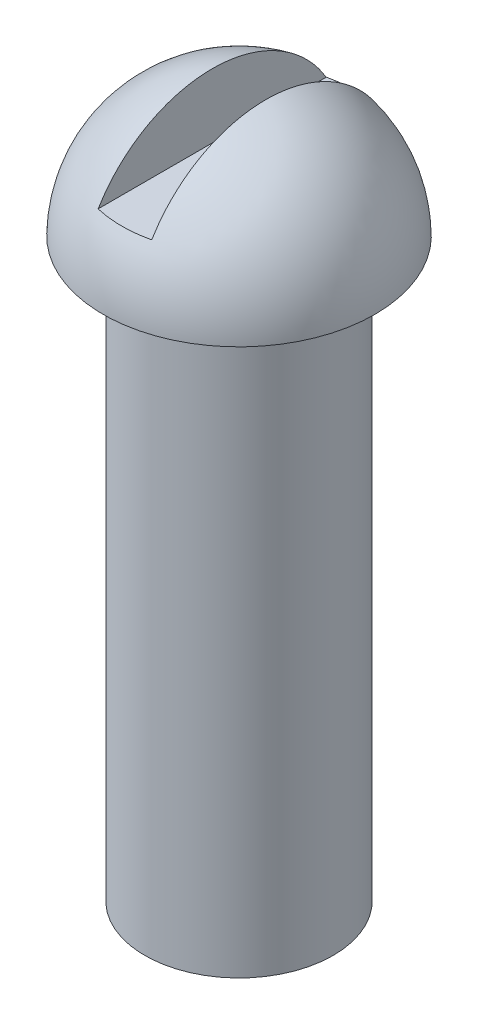
ISO-10303-21;
HEADER;
FILE_DESCRIPTION(('STEP AP214'),'2;1');
FILE_NAME('part.step','',(''),(''),'','','');
FILE_SCHEMA(('AUTOMOTIVE_DESIGN { 1 0 10303 214 1 1 1 1 }'));
ENDSEC;
DATA;
#1=APPLICATION_CONTEXT('core data for automotive mechanical design processes');
#2=APPLICATION_PROTOCOL_DEFINITION('international standard','automotive_design',2000,#1);
#3=PRODUCT_CONTEXT('',#1,'mechanical');
#4=PRODUCT('Part','Part','',(#3));
#5=PRODUCT_RELATED_PRODUCT_CATEGORY('part','',(#4));
#6=PRODUCT_DEFINITION_FORMATION('','',#4);
#7=PRODUCT_DEFINITION_CONTEXT('part definition',#1,'design');
#8=PRODUCT_DEFINITION('design','',#6,#7);
#9=PRODUCT_DEFINITION_SHAPE('','',#8);
#10=(LENGTH_UNIT() NAMED_UNIT(*) SI_UNIT(.MILLI.,.METRE.));
#11=(NAMED_UNIT(*) PLANE_ANGLE_UNIT() SI_UNIT($,.RADIAN.));
#12=(NAMED_UNIT(*) SI_UNIT($,.STERADIAN.) SOLID_ANGLE_UNIT());
#13=UNCERTAINTY_MEASURE_WITH_UNIT(LENGTH_MEASURE(1.E-05),#10,'distance_accuracy_value','');
#14=(GEOMETRIC_REPRESENTATION_CONTEXT(3) GLOBAL_UNCERTAINTY_ASSIGNED_CONTEXT((#13)) GLOBAL_UNIT_ASSIGNED_CONTEXT((#10,
#11,#12)) REPRESENTATION_CONTEXT('',''));
#15=CARTESIAN_POINT('',(0.,0.,0.));
#16=DIRECTION('',(0.,0.,1.));
#17=DIRECTION('',(1.,0.,0.));
#18=AXIS2_PLACEMENT_3D('',#15,#16,#17);
#19=CARTESIAN_POINT('',(0.,-0.0767715000000004,0.));
#20=DIRECTION('',(0.,1.,0.));
#21=DIRECTION('',(1.,0.,0.));
#22=AXIS2_PLACEMENT_3D('',#19,#20,#21);
#23=SPHERICAL_SURFACE('',#22,5.1567715);
#24=CARTESIAN_POINT('',(0.,2.54,0.));
#25=DIRECTION('',(0.,1.,0.));
#26=DIRECTION('',(-1.,0.,0.));
#27=AXIS2_PLACEMENT_3D('',#24,#25,#26);
#28=CIRCLE('',#27,4.44351203666649);
#29=CARTESIAN_POINT('',(-1.016,2.54,-4.32579972028294));
#30=VERTEX_POINT('',#29);
#31=CARTESIAN_POINT('',(1.016,2.54,-4.32579972028294));
#32=VERTEX_POINT('',#31);
#33=EDGE_CURVE('E39',#30,#32,#28,.F.);
#34=ORIENTED_EDGE('',*,*,#33,.T.);
#35=CARTESIAN_POINT('',(1.016,-0.0767715000000001,0.));
#36=DIRECTION('',(1.,0.,0.));
#37=DIRECTION('',(0.,1.,0.));
#38=AXIS2_PLACEMENT_3D('',#35,#36,#37);
#39=CIRCLE('',#38,5.05569345423674);
#40=CARTESIAN_POINT('',(1.016,2.54,4.32579972028294));
#41=VERTEX_POINT('',#40);
#42=EDGE_CURVE('E11',#41,#32,#39,.F.);
#43=ORIENTED_EDGE('',*,*,#42,.F.);
#44=CARTESIAN_POINT('',(-1.016,2.54,4.32579972028294));
#45=VERTEX_POINT('',#44);
#46=EDGE_CURVE('E46',#41,#45,#28,.F.);
#47=ORIENTED_EDGE('',*,*,#46,.T.);
#48=CARTESIAN_POINT('',(-1.016,-0.0767714999999996,0.));
#49=DIRECTION('',(-1.,0.,0.));
#50=DIRECTION('',(0.,-1.,0.));
#51=AXIS2_PLACEMENT_3D('',#48,#49,#50);
#52=CIRCLE('',#51,5.05569345423674);
#53=EDGE_CURVE('E58',#30,#45,#52,.F.);
#54=ORIENTED_EDGE('',*,*,#53,.F.);
#55=EDGE_LOOP('',(#34,#43,#47,#54));
#56=FACE_BOUND('',#55,.T.);
#57=CARTESIAN_POINT('',(0.,0.,0.));
#58=DIRECTION('',(0.,1.,0.));
#59=DIRECTION('',(-1.,0.,0.));
#60=AXIS2_PLACEMENT_3D('',#57,#58,#59);
#61=CIRCLE('',#60,5.1562);
#62=CARTESIAN_POINT('',(-5.1562,0.,0.));
#63=VERTEX_POINT('',#62);
#64=EDGE_CURVE('E63',#63,#63,#61,.T.);
#65=ORIENTED_EDGE('',*,*,#64,.T.);
#66=EDGE_LOOP('',(#65));
#67=FACE_BOUND('',#66,.T.);
#68=ADVANCED_FACE('F32',(#56,#67),#23,.T.);
#69=CARTESIAN_POINT('',(5.1562,0.,0.));
#70=DIRECTION('',(0.,-1.,0.));
#71=DIRECTION('',(1.,0.,0.));
#72=AXIS2_PLACEMENT_3D('',#69,#70,#71);
#73=PLANE('',#72);
#74=CARTESIAN_POINT('',(0.,0.,0.));
#75=DIRECTION('',(0.,1.,0.));
#76=DIRECTION('',(-1.,0.,0.));
#77=AXIS2_PLACEMENT_3D('',#74,#75,#76);
#78=CIRCLE('',#77,3.57187500000001);
#79=CARTESIAN_POINT('',(-3.57187500000001,0.,0.));
#80=VERTEX_POINT('',#79);
#81=EDGE_CURVE('E75',#80,#80,#78,.T.);
#82=ORIENTED_EDGE('',*,*,#81,.T.);
#83=EDGE_LOOP('',(#82));
#84=FACE_BOUND('',#83,.T.);
#85=ORIENTED_EDGE('',*,*,#64,.F.);
#86=EDGE_LOOP('',(#85));
#87=FACE_BOUND('',#86,.T.);
#88=ADVANCED_FACE('F81',(#84,#87),#73,.T.);
#89=CARTESIAN_POINT('',(0.,10.1105238752547,0.));
#90=DIRECTION('',(0.,1.,0.));
#91=DIRECTION('',(-1.,0.,0.));
#92=AXIS2_PLACEMENT_3D('',#89,#90,#91);
#93=CYLINDRICAL_SURFACE('',#92,3.571875);
#94=CARTESIAN_POINT('',(0.,-21.844,0.));
#95=DIRECTION('',(0.,1.,0.));
#96=DIRECTION('',(-1.,0.,0.));
#97=AXIS2_PLACEMENT_3D('',#94,#95,#96);
#98=CIRCLE('',#97,3.571875);
#99=CARTESIAN_POINT('',(-3.571875,-21.844,0.));
#100=VERTEX_POINT('',#99);
#101=EDGE_CURVE('E70',#100,#100,#98,.T.);
#102=ORIENTED_EDGE('',*,*,#101,.T.);
#103=EDGE_LOOP('',(#102));
#104=FACE_BOUND('',#103,.T.);
#105=ORIENTED_EDGE('',*,*,#81,.F.);
#106=EDGE_LOOP('',(#105));
#107=FACE_BOUND('',#106,.T.);
#108=ADVANCED_FACE('F83',(#104,#107),#93,.T.);
#109=CARTESIAN_POINT('',(3.571875,-21.844,0.));
#110=DIRECTION('',(0.,-1.,0.));
#111=DIRECTION('',(1.,0.,0.));
#112=AXIS2_PLACEMENT_3D('',#109,#110,#111);
#113=PLANE('',#112);
#114=ORIENTED_EDGE('',*,*,#101,.F.);
#115=EDGE_LOOP('',(#114));
#116=FACE_BOUND('',#115,.T.);
#117=ADVANCED_FACE('F89',(#116),#113,.T.);
#118=CARTESIAN_POINT('',(1.016,2.54,-5.1562));
#119=DIRECTION('',(1.,0.,0.));
#120=DIRECTION('',(0.,1.,0.));
#121=AXIS2_PLACEMENT_3D('',#118,#119,#120);
#122=PLANE('',#121);
#123=ORIENTED_EDGE('',*,*,#42,.T.);
#124=DIRECTION('',(0.,0.,1.));
#125=VECTOR('',#124,1.);
#126=CARTESIAN_POINT('',(1.016,2.54,-5.1562));
#127=LINE('',#126,#125);
#128=EDGE_CURVE('E67',#32,#41,#127,.T.);
#129=ORIENTED_EDGE('',*,*,#128,.T.);
#130=EDGE_LOOP('',(#123,#129));
#131=FACE_BOUND('',#130,.T.);
#132=ADVANCED_FACE('F95',(#131),#122,.F.);
#133=CARTESIAN_POINT('',(1.016,2.54,-5.1562));
#134=DIRECTION('',(0.,1.,0.));
#135=DIRECTION('',(-1.,0.,0.));
#136=AXIS2_PLACEMENT_3D('',#133,#134,#135);
#137=PLANE('',#136);
#138=DIRECTION('',(0.,0.,1.));
#139=VECTOR('',#138,1.);
#140=CARTESIAN_POINT('',(-1.016,2.54,-5.1562));
#141=LINE('',#140,#139);
#142=EDGE_CURVE('E66',#30,#45,#141,.T.);
#143=ORIENTED_EDGE('',*,*,#142,.T.);
#144=ORIENTED_EDGE('',*,*,#46,.F.);
#145=ORIENTED_EDGE('',*,*,#128,.F.);
#146=ORIENTED_EDGE('',*,*,#33,.F.);
#147=EDGE_LOOP('',(#143,#144,#145,#146));
#148=FACE_BOUND('',#147,.T.);
#149=ADVANCED_FACE('F65',(#148),#137,.T.);
#150=CARTESIAN_POINT('',(-1.016,4.97892195423674,-5.1562));
#151=DIRECTION('',(-1.,0.,0.));
#152=DIRECTION('',(0.,-1.,0.));
#153=AXIS2_PLACEMENT_3D('',#150,#151,#152);
#154=PLANE('',#153);
#155=ORIENTED_EDGE('',*,*,#142,.F.);
#156=ORIENTED_EDGE('',*,*,#53,.T.);
#157=EDGE_LOOP('',(#155,#156));
#158=FACE_BOUND('',#157,.T.);
#159=ADVANCED_FACE('F68',(#158),#154,.F.);
#160=CLOSED_SHELL('',(#68,#88,#108,#117,#132,#149,#159));
#161=MANIFOLD_SOLID_BREP('B2',#160);
#162=ADVANCED_BREP_SHAPE_REPRESENTATION('',(#18,#161),#14);
#163=SHAPE_DEFINITION_REPRESENTATION(#9,#162);
ENDSEC;
END-ISO-10303-21;
